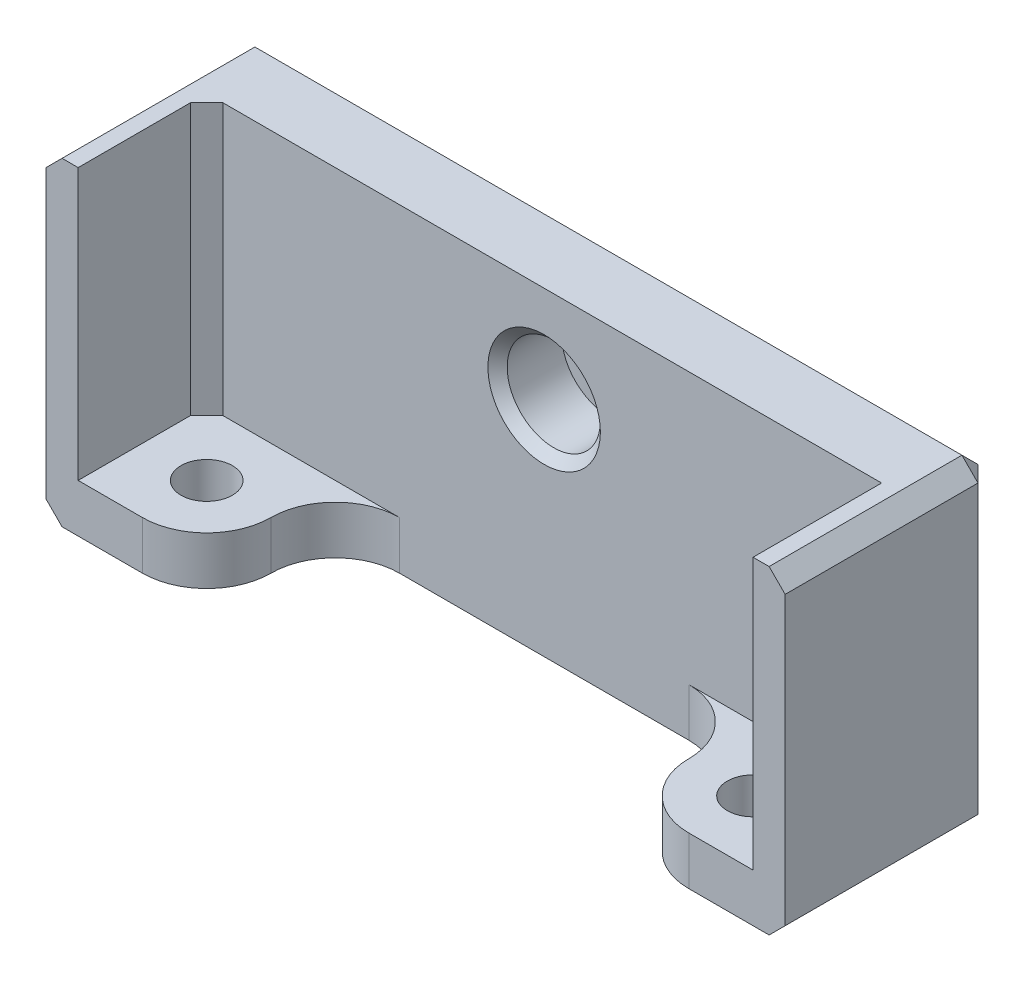
ISO-10303-21;
HEADER;
FILE_DESCRIPTION(('STEP AP214'),'2;1');
FILE_NAME('part.step','',(''),(''),'','','');
FILE_SCHEMA(('AUTOMOTIVE_DESIGN { 1 0 10303 214 1 1 1 1 }'));
ENDSEC;
DATA;
#1=APPLICATION_CONTEXT('core data for automotive mechanical design processes');
#2=APPLICATION_PROTOCOL_DEFINITION('international standard','automotive_design',2000,#1);
#3=PRODUCT_CONTEXT('',#1,'mechanical');
#4=PRODUCT('Part','Part','',(#3));
#5=PRODUCT_RELATED_PRODUCT_CATEGORY('part','',(#4));
#6=PRODUCT_DEFINITION_FORMATION('','',#4);
#7=PRODUCT_DEFINITION_CONTEXT('part definition',#1,'design');
#8=PRODUCT_DEFINITION('design','',#6,#7);
#9=PRODUCT_DEFINITION_SHAPE('','',#8);
#10=(LENGTH_UNIT() NAMED_UNIT(*) SI_UNIT(.MILLI.,.METRE.));
#11=(NAMED_UNIT(*) PLANE_ANGLE_UNIT() SI_UNIT($,.RADIAN.));
#12=(NAMED_UNIT(*) SI_UNIT($,.STERADIAN.) SOLID_ANGLE_UNIT());
#13=UNCERTAINTY_MEASURE_WITH_UNIT(LENGTH_MEASURE(1.E-05),#10,'distance_accuracy_value','');
#14=(GEOMETRIC_REPRESENTATION_CONTEXT(3) GLOBAL_UNCERTAINTY_ASSIGNED_CONTEXT((#13)) GLOBAL_UNIT_ASSIGNED_CONTEXT((#10,
#11,#12)) REPRESENTATION_CONTEXT('',''));
#15=CARTESIAN_POINT('',(0.,0.,0.));
#16=DIRECTION('',(0.,0.,1.));
#17=DIRECTION('',(1.,0.,0.));
#18=AXIS2_PLACEMENT_3D('',#15,#16,#17);
#19=CARTESIAN_POINT('',(0.,0.,4.));
#20=DIRECTION('',(0.,0.,1.));
#21=DIRECTION('',(1.,0.,0.));
#22=AXIS2_PLACEMENT_3D('',#19,#20,#21);
#23=PLANE('',#22);
#24=DIRECTION('',(-1.,0.,0.));
#25=VECTOR('',#24,1.);
#26=CARTESIAN_POINT('',(21.,6.,4.));
#27=LINE('',#26,#25);
#28=CARTESIAN_POINT('',(21.,6.,4.));
#29=VERTEX_POINT('',#28);
#30=CARTESIAN_POINT('',(-20.,6.,4.));
#31=VERTEX_POINT('',#30);
#32=EDGE_CURVE('E237',#29,#31,#27,.T.);
#33=ORIENTED_EDGE('',*,*,#32,.T.);
#34=DIRECTION('',(0.,-1.,0.));
#35=VECTOR('',#34,1.);
#36=CARTESIAN_POINT('',(-20.,-10.86,4.));
#37=LINE('',#36,#35);
#38=CARTESIAN_POINT('',(-20.,-10.86,4.));
#39=VERTEX_POINT('',#38);
#40=EDGE_CURVE('E289',#31,#39,#37,.T.);
#41=ORIENTED_EDGE('',*,*,#40,.T.);
#42=DIRECTION('',(-1.,0.,0.));
#43=VECTOR('',#42,1.);
#44=CARTESIAN_POINT('',(0.,-10.86,4.));
#45=LINE('',#44,#43);
#46=CARTESIAN_POINT('',(-9.,-10.86,4.));
#47=VERTEX_POINT('',#46);
#48=EDGE_CURVE('E192',#47,#39,#45,.T.);
#49=ORIENTED_EDGE('',*,*,#48,.F.);
#50=DIRECTION('',(0.,1.,0.));
#51=VECTOR('',#50,1.);
#52=CARTESIAN_POINT('',(-9.,-13.86,4.));
#53=LINE('',#52,#51);
#54=CARTESIAN_POINT('',(-9.,-13.86,4.));
#55=VERTEX_POINT('',#54);
#56=EDGE_CURVE('E249',#47,#55,#53,.F.);
#57=ORIENTED_EDGE('',*,*,#56,.T.);
#58=DIRECTION('',(1.,0.,0.));
#59=VECTOR('',#58,1.);
#60=CARTESIAN_POINT('',(7.93725393319378,-13.86,4.));
#61=LINE('',#60,#59);
#62=CARTESIAN_POINT('',(9.00000000000001,-13.86,4.));
#63=VERTEX_POINT('',#62);
#64=EDGE_CURVE('E230',#55,#63,#61,.T.);
#65=ORIENTED_EDGE('',*,*,#64,.T.);
#66=DIRECTION('',(0.,-1.,0.));
#67=VECTOR('',#66,1.);
#68=CARTESIAN_POINT('',(9.00000000000001,-10.86,4.));
#69=LINE('',#68,#67);
#70=CARTESIAN_POINT('',(9.00000000000001,-10.86,4.));
#71=VERTEX_POINT('',#70);
#72=EDGE_CURVE('E253',#63,#71,#69,.F.);
#73=ORIENTED_EDGE('',*,*,#72,.T.);
#74=DIRECTION('',(-1.,0.,0.));
#75=VECTOR('',#74,1.);
#76=CARTESIAN_POINT('',(0.,-10.86,4.));
#77=LINE('',#76,#75);
#78=CARTESIAN_POINT('',(21.,-10.86,4.));
#79=VERTEX_POINT('',#78);
#80=EDGE_CURVE('E422',#79,#71,#77,.T.);
#81=ORIENTED_EDGE('',*,*,#80,.F.);
#82=DIRECTION('',(0.,1.,0.));
#83=VECTOR('',#82,1.);
#84=CARTESIAN_POINT('',(21.,-13.86,4.));
#85=LINE('',#84,#83);
#86=EDGE_CURVE('E234',#79,#29,#85,.T.);
#87=ORIENTED_EDGE('',*,*,#86,.T.);
#88=EDGE_LOOP('',(#33,#41,#49,#57,#65,#73,#81,#87));
#89=FACE_BOUND('',#88,.T.);
#90=CARTESIAN_POINT('',(0.,0.,4.));
#91=DIRECTION('',(0.,0.,1.));
#92=DIRECTION('',(1.,0.,0.));
#93=AXIS2_PLACEMENT_3D('',#90,#91,#92);
#94=CIRCLE('',#93,3.5);
#95=CARTESIAN_POINT('',(3.5,0.,4.));
#96=VERTEX_POINT('',#95);
#97=EDGE_CURVE('E245',#96,#96,#94,.F.);
#98=ORIENTED_EDGE('',*,*,#97,.T.);
#99=EDGE_LOOP('',(#98));
#100=FACE_BOUND('',#99,.T.);
#101=ADVANCED_FACE('F41',(#89,#100),#23,.T.);
#102=CARTESIAN_POINT('',(21.,-13.86,4.));
#103=DIRECTION('',(0.,1.,0.));
#104=DIRECTION('',(-1.,0.,0.));
#105=AXIS2_PLACEMENT_3D('',#102,#103,#104);
#106=PLANE('',#105);
#107=DIRECTION('',(1.,0.,0.));
#108=VECTOR('',#107,1.);
#109=CARTESIAN_POINT('',(-23.,-13.86,12.));
#110=LINE('',#109,#108);
#111=CARTESIAN_POINT('',(-22.,-13.86,12.));
#112=VERTEX_POINT('',#111);
#113=CARTESIAN_POINT('',(-17.,-13.86,12.));
#114=VERTEX_POINT('',#113);
#115=EDGE_CURVE('E220',#112,#114,#110,.T.);
#116=ORIENTED_EDGE('',*,*,#115,.F.);
#117=DIRECTION('',(0.,0.,-1.));
#118=VECTOR('',#117,1.);
#119=CARTESIAN_POINT('',(-22.,-13.86,4.));
#120=LINE('',#119,#118);
#121=CARTESIAN_POINT('',(-22.,-13.86,0.));
#122=VERTEX_POINT('',#121);
#123=EDGE_CURVE('E327',#112,#122,#120,.T.);
#124=ORIENTED_EDGE('',*,*,#123,.T.);
#125=DIRECTION('',(1.,0.,0.));
#126=VECTOR('',#125,1.);
#127=CARTESIAN_POINT('',(23.,-13.86,0.));
#128=LINE('',#127,#126);
#129=CARTESIAN_POINT('',(22.,-13.86,0.));
#130=VERTEX_POINT('',#129);
#131=EDGE_CURVE('E321',#122,#130,#128,.T.);
#132=ORIENTED_EDGE('',*,*,#131,.T.);
#133=DIRECTION('',(0.,0.,1.));
#134=VECTOR('',#133,1.);
#135=CARTESIAN_POINT('',(22.,-13.86,4.));
#136=LINE('',#135,#134);
#137=CARTESIAN_POINT('',(22.,-13.86,12.));
#138=VERTEX_POINT('',#137);
#139=EDGE_CURVE('E324',#130,#138,#136,.T.);
#140=ORIENTED_EDGE('',*,*,#139,.T.);
#141=DIRECTION('',(-1.,0.,0.));
#142=VECTOR('',#141,1.);
#143=CARTESIAN_POINT('',(23.,-13.86,12.));
#144=LINE('',#143,#142);
#145=CARTESIAN_POINT('',(17.,-13.86,12.));
#146=VERTEX_POINT('',#145);
#147=EDGE_CURVE('E210',#138,#146,#144,.T.);
#148=ORIENTED_EDGE('',*,*,#147,.T.);
#149=CARTESIAN_POINT('',(17.,-13.86,8.));
#150=DIRECTION('',(0.,1.,0.));
#151=DIRECTION('',(-1.,0.,0.));
#152=AXIS2_PLACEMENT_3D('',#149,#150,#151);
#153=CIRCLE('',#152,4.);
#154=CARTESIAN_POINT('',(13.,-13.86,8.));
#155=VERTEX_POINT('',#154);
#156=EDGE_CURVE('E265',#146,#155,#153,.F.);
#157=ORIENTED_EDGE('',*,*,#156,.T.);
#158=CARTESIAN_POINT('',(9.00000000000001,-13.86,8.));
#159=DIRECTION('',(0.,1.,0.));
#160=DIRECTION('',(-1.,0.,0.));
#161=AXIS2_PLACEMENT_3D('',#158,#159,#160);
#162=CIRCLE('',#161,4.);
#163=EDGE_CURVE('E276',#155,#63,#162,.T.);
#164=ORIENTED_EDGE('',*,*,#163,.T.);
#165=ORIENTED_EDGE('',*,*,#64,.F.);
#166=CARTESIAN_POINT('',(-9.,-13.86,8.));
#167=DIRECTION('',(0.,1.,0.));
#168=DIRECTION('',(-1.,0.,0.));
#169=AXIS2_PLACEMENT_3D('',#166,#167,#168);
#170=CIRCLE('',#169,4.);
#171=CARTESIAN_POINT('',(-13.,-13.86,8.));
#172=VERTEX_POINT('',#171);
#173=EDGE_CURVE('E286',#55,#172,#170,.T.);
#174=ORIENTED_EDGE('',*,*,#173,.T.);
#175=CARTESIAN_POINT('',(-17.,-13.86,8.));
#176=DIRECTION('',(0.,1.,0.));
#177=DIRECTION('',(-1.,0.,0.));
#178=AXIS2_PLACEMENT_3D('',#175,#176,#177);
#179=CIRCLE('',#178,4.);
#180=EDGE_CURVE('E261',#172,#114,#179,.F.);
#181=ORIENTED_EDGE('',*,*,#180,.T.);
#182=EDGE_LOOP('',(#116,#124,#132,#140,#148,#157,#164,#165,#174,#181));
#183=FACE_BOUND('',#182,.T.);
#184=CARTESIAN_POINT('',(-17.,-13.86,8.));
#185=DIRECTION('',(0.,-1.,0.));
#186=DIRECTION('',(1.,0.,0.));
#187=AXIS2_PLACEMENT_3D('',#184,#185,#186);
#188=CIRCLE('',#187,1.6);
#189=CARTESIAN_POINT('',(-15.4,-13.86,8.));
#190=VERTEX_POINT('',#189);
#191=EDGE_CURVE('E425',#190,#190,#188,.T.);
#192=ORIENTED_EDGE('',*,*,#191,.F.);
#193=EDGE_LOOP('',(#192));
#194=FACE_BOUND('',#193,.T.);
#195=CARTESIAN_POINT('',(17.,-13.86,8.));
#196=DIRECTION('',(0.,-1.,0.));
#197=DIRECTION('',(-1.,0.,0.));
#198=AXIS2_PLACEMENT_3D('',#195,#196,#197);
#199=CIRCLE('',#198,1.6);
#200=CARTESIAN_POINT('',(15.4,-13.86,8.));
#201=VERTEX_POINT('',#200);
#202=EDGE_CURVE('E294',#201,#201,#199,.T.);
#203=ORIENTED_EDGE('',*,*,#202,.F.);
#204=EDGE_LOOP('',(#203));
#205=FACE_BOUND('',#204,.T.);
#206=ADVANCED_FACE('F490',(#183,#194,#205),#106,.F.);
#207=CARTESIAN_POINT('',(7.93725393319377,6.,4.));
#208=DIRECTION('',(0.,-1.,0.));
#209=DIRECTION('',(1.,0.,0.));
#210=AXIS2_PLACEMENT_3D('',#207,#208,#209);
#211=PLANE('',#210);
#212=DIRECTION('',(-1.,0.,0.));
#213=VECTOR('',#212,1.);
#214=CARTESIAN_POINT('',(-23.,6.,0.));
#215=LINE('',#214,#213);
#216=CARTESIAN_POINT('',(22.,6.,0.));
#217=VERTEX_POINT('',#216);
#218=CARTESIAN_POINT('',(-22.,6.,0.));
#219=VERTEX_POINT('',#218);
#220=EDGE_CURVE('E330',#217,#219,#215,.T.);
#221=ORIENTED_EDGE('',*,*,#220,.T.);
#222=DIRECTION('',(0.,0.,1.));
#223=VECTOR('',#222,1.);
#224=CARTESIAN_POINT('',(-22.,6.,4.));
#225=LINE('',#224,#223);
#226=CARTESIAN_POINT('',(-22.,6.,12.));
#227=VERTEX_POINT('',#226);
#228=EDGE_CURVE('E336',#219,#227,#225,.T.);
#229=ORIENTED_EDGE('',*,*,#228,.T.);
#230=DIRECTION('',(1.,0.,0.));
#231=VECTOR('',#230,1.);
#232=CARTESIAN_POINT('',(-23.,6.,12.));
#233=LINE('',#232,#231);
#234=CARTESIAN_POINT('',(-21.,6.,12.));
#235=VERTEX_POINT('',#234);
#236=EDGE_CURVE('E223',#227,#235,#233,.T.);
#237=ORIENTED_EDGE('',*,*,#236,.T.);
#238=DIRECTION('',(0.,0.,-1.));
#239=VECTOR('',#238,1.);
#240=CARTESIAN_POINT('',(-21.,6.,12.));
#241=LINE('',#240,#239);
#242=CARTESIAN_POINT('',(-21.,6.,4.99999999999999));
#243=VERTEX_POINT('',#242);
#244=EDGE_CURVE('E208',#235,#243,#241,.T.);
#245=ORIENTED_EDGE('',*,*,#244,.T.);
#246=DIRECTION('',(-0.70710678118655,0.,0.707106781186545));
#247=VECTOR('',#246,1.);
#248=CARTESIAN_POINT('',(-6.03137303340302,6.,-9.96862696659689));
#249=LINE('',#248,#247);
#250=EDGE_CURVE('E11',#243,#31,#249,.F.);
#251=ORIENTED_EDGE('',*,*,#250,.T.);
#252=ORIENTED_EDGE('',*,*,#32,.F.);
#253=DIRECTION('',(0.,0.,-1.));
#254=VECTOR('',#253,1.);
#255=CARTESIAN_POINT('',(21.,6.,12.));
#256=LINE('',#255,#254);
#257=CARTESIAN_POINT('',(21.,6.,12.));
#258=VERTEX_POINT('',#257);
#259=EDGE_CURVE('E439',#258,#29,#256,.T.);
#260=ORIENTED_EDGE('',*,*,#259,.F.);
#261=DIRECTION('',(-1.,0.,0.));
#262=VECTOR('',#261,1.);
#263=CARTESIAN_POINT('',(23.,6.,12.));
#264=LINE('',#263,#262);
#265=CARTESIAN_POINT('',(22.,6.,12.));
#266=VERTEX_POINT('',#265);
#267=EDGE_CURVE('E216',#266,#258,#264,.T.);
#268=ORIENTED_EDGE('',*,*,#267,.F.);
#269=DIRECTION('',(0.,0.,-1.));
#270=VECTOR('',#269,1.);
#271=CARTESIAN_POINT('',(22.,6.,4.));
#272=LINE('',#271,#270);
#273=EDGE_CURVE('E333',#266,#217,#272,.T.);
#274=ORIENTED_EDGE('',*,*,#273,.T.);
#275=EDGE_LOOP('',(#221,#229,#237,#245,#251,#252,#260,#268,#274));
#276=FACE_BOUND('',#275,.T.);
#277=ADVANCED_FACE('F460',(#276),#211,.F.);
#278=CARTESIAN_POINT('',(0.,0.,4.));
#279=DIRECTION('',(0.,0.,-1.));
#280=DIRECTION('',(-1.,0.,0.));
#281=AXIS2_PLACEMENT_3D('',#278,#279,#280);
#282=CYLINDRICAL_SURFACE('',#281,2.9);
#283=CARTESIAN_POINT('',(0.,0.,3.4));
#284=DIRECTION('',(0.,0.,1.));
#285=DIRECTION('',(1.,0.,0.));
#286=AXIS2_PLACEMENT_3D('',#283,#284,#285);
#287=CIRCLE('',#286,2.9);
#288=CARTESIAN_POINT('',(2.9,0.,3.4));
#289=VERTEX_POINT('',#288);
#290=EDGE_CURVE('E241',#289,#289,#287,.T.);
#291=ORIENTED_EDGE('',*,*,#290,.T.);
#292=EDGE_LOOP('',(#291));
#293=FACE_BOUND('',#292,.T.);
#294=CARTESIAN_POINT('',(0.,0.,0.));
#295=DIRECTION('',(0.,0.,1.));
#296=DIRECTION('',(1.,0.,0.));
#297=AXIS2_PLACEMENT_3D('',#294,#295,#296);
#298=CIRCLE('',#297,2.9);
#299=CARTESIAN_POINT('',(2.9,0.,0.));
#300=VERTEX_POINT('',#299);
#301=EDGE_CURVE('E226',#300,#300,#298,.T.);
#302=ORIENTED_EDGE('',*,*,#301,.F.);
#303=EDGE_LOOP('',(#302));
#304=FACE_BOUND('',#303,.T.);
#305=ADVANCED_FACE('F534',(#293,#304),#282,.F.);
#306=CARTESIAN_POINT('',(0.,0.,3.4));
#307=DIRECTION('',(0.,0.,1.));
#308=DIRECTION('',(1.,0.,0.));
#309=AXIS2_PLACEMENT_3D('',#306,#307,#308);
#310=CONICAL_SURFACE('',#309,2.9,0.785398163397449);
#311=ORIENTED_EDGE('',*,*,#97,.F.);
#312=EDGE_LOOP('',(#311));
#313=FACE_BOUND('',#312,.T.);
#314=ORIENTED_EDGE('',*,*,#290,.F.);
#315=EDGE_LOOP('',(#314));
#316=FACE_BOUND('',#315,.T.);
#317=ADVANCED_FACE('F539',(#313,#316),#310,.F.);
#318=CARTESIAN_POINT('',(-21.,0.,0.));
#319=DIRECTION('',(1.,0.,0.));
#320=DIRECTION('',(0.,1.,0.));
#321=AXIS2_PLACEMENT_3D('',#318,#319,#320);
#322=PLANE('',#321);
#323=DIRECTION('',(0.,0.,1.));
#324=VECTOR('',#323,1.);
#325=CARTESIAN_POINT('',(-21.,-10.86,0.));
#326=LINE('',#325,#324);
#327=CARTESIAN_POINT('',(-21.,-10.86,4.99999999999999));
#328=VERTEX_POINT('',#327);
#329=CARTESIAN_POINT('',(-21.,-10.86,12.));
#330=VERTEX_POINT('',#329);
#331=EDGE_CURVE('E181',#328,#330,#326,.T.);
#332=ORIENTED_EDGE('',*,*,#331,.F.);
#333=DIRECTION('',(0.,1.,0.));
#334=VECTOR('',#333,1.);
#335=CARTESIAN_POINT('',(-21.,6.,4.99999999999999));
#336=LINE('',#335,#334);
#337=EDGE_CURVE('E305',#328,#243,#336,.T.);
#338=ORIENTED_EDGE('',*,*,#337,.T.);
#339=ORIENTED_EDGE('',*,*,#244,.F.);
#340=DIRECTION('',(0.,1.,0.));
#341=VECTOR('',#340,1.);
#342=CARTESIAN_POINT('',(-21.,6.,12.));
#343=LINE('',#342,#341);
#344=EDGE_CURVE('E199',#330,#235,#343,.T.);
#345=ORIENTED_EDGE('',*,*,#344,.F.);
#346=EDGE_LOOP('',(#332,#338,#339,#345));
#347=FACE_BOUND('',#346,.T.);
#348=ADVANCED_FACE('F206',(#347),#322,.T.);
#349=CARTESIAN_POINT('',(-23.,6.,12.));
#350=DIRECTION('',(0.,0.,-1.));
#351=DIRECTION('',(0.,1.,0.));
#352=AXIS2_PLACEMENT_3D('',#349,#350,#351);
#353=PLANE('',#352);
#354=DIRECTION('',(0.,1.,0.));
#355=VECTOR('',#354,1.);
#356=CARTESIAN_POINT('',(-23.,6.,12.));
#357=LINE('',#356,#355);
#358=CARTESIAN_POINT('',(-23.,-12.86,12.));
#359=VERTEX_POINT('',#358);
#360=CARTESIAN_POINT('',(-23.,5.,12.));
#361=VERTEX_POINT('',#360);
#362=EDGE_CURVE('E214',#359,#361,#357,.T.);
#363=ORIENTED_EDGE('',*,*,#362,.F.);
#364=DIRECTION('',(-0.707106781186552,0.707106781186543,0.));
#365=VECTOR('',#364,1.);
#366=CARTESIAN_POINT('',(-23.,-12.86,12.));
#367=LINE('',#366,#365);
#368=EDGE_CURVE('E318',#359,#112,#367,.F.);
#369=ORIENTED_EDGE('',*,*,#368,.T.);
#370=ORIENTED_EDGE('',*,*,#115,.T.);
#371=DIRECTION('',(0.,-1.,0.));
#372=VECTOR('',#371,1.);
#373=CARTESIAN_POINT('',(-17.,-10.86,12.));
#374=LINE('',#373,#372);
#375=CARTESIAN_POINT('',(-17.,-10.86,12.));
#376=VERTEX_POINT('',#375);
#377=EDGE_CURVE('E202',#114,#376,#374,.F.);
#378=ORIENTED_EDGE('',*,*,#377,.T.);
#379=DIRECTION('',(-1.,0.,0.));
#380=VECTOR('',#379,1.);
#381=CARTESIAN_POINT('',(-23.,-10.86,12.));
#382=LINE('',#381,#380);
#383=EDGE_CURVE('E185',#376,#330,#382,.T.);
#384=ORIENTED_EDGE('',*,*,#383,.T.);
#385=ORIENTED_EDGE('',*,*,#344,.T.);
#386=ORIENTED_EDGE('',*,*,#236,.F.);
#387=DIRECTION('',(0.70710678118655,0.707106781186545,0.));
#388=VECTOR('',#387,1.);
#389=CARTESIAN_POINT('',(-23.,5.,12.));
#390=LINE('',#389,#388);
#391=EDGE_CURVE('E315',#227,#361,#390,.F.);
#392=ORIENTED_EDGE('',*,*,#391,.T.);
#393=EDGE_LOOP('',(#363,#369,#370,#378,#384,#385,#386,#392));
#394=FACE_BOUND('',#393,.T.);
#395=ADVANCED_FACE('F197',(#394),#353,.F.);
#396=CARTESIAN_POINT('',(-23.,0.,0.));
#397=DIRECTION('',(1.,0.,0.));
#398=DIRECTION('',(0.,1.,0.));
#399=AXIS2_PLACEMENT_3D('',#396,#397,#398);
#400=PLANE('',#399);
#401=DIRECTION('',(0.,1.,0.));
#402=VECTOR('',#401,1.);
#403=CARTESIAN_POINT('',(-23.,-13.86,-1.));
#404=LINE('',#403,#402);
#405=CARTESIAN_POINT('',(-23.,-12.86,-1.));
#406=VERTEX_POINT('',#405);
#407=CARTESIAN_POINT('',(-23.,5.,-1.));
#408=VERTEX_POINT('',#407);
#409=EDGE_CURVE('E299',#406,#408,#404,.T.);
#410=ORIENTED_EDGE('',*,*,#409,.F.);
#411=DIRECTION('',(0.,0.,1.));
#412=VECTOR('',#411,1.);
#413=CARTESIAN_POINT('',(-23.,-12.86,0.));
#414=LINE('',#413,#412);
#415=EDGE_CURVE('E311',#406,#359,#414,.T.);
#416=ORIENTED_EDGE('',*,*,#415,.T.);
#417=ORIENTED_EDGE('',*,*,#362,.T.);
#418=DIRECTION('',(0.,0.,-1.));
#419=VECTOR('',#418,1.);
#420=CARTESIAN_POINT('',(-23.,5.,0.));
#421=LINE('',#420,#419);
#422=EDGE_CURVE('E308',#361,#408,#421,.T.);
#423=ORIENTED_EDGE('',*,*,#422,.T.);
#424=EDGE_LOOP('',(#410,#416,#417,#423));
#425=FACE_BOUND('',#424,.T.);
#426=ADVANCED_FACE('F474',(#425),#400,.F.);
#427=CARTESIAN_POINT('',(21.,0.,0.));
#428=DIRECTION('',(-1.,0.,0.));
#429=DIRECTION('',(0.,1.,0.));
#430=AXIS2_PLACEMENT_3D('',#427,#428,#429);
#431=PLANE('',#430);
#432=DIRECTION('',(0.,0.,-1.));
#433=VECTOR('',#432,1.);
#434=CARTESIAN_POINT('',(21.,-10.86,0.));
#435=LINE('',#434,#433);
#436=CARTESIAN_POINT('',(21.,-10.86,12.));
#437=VERTEX_POINT('',#436);
#438=EDGE_CURVE('E418',#437,#79,#435,.T.);
#439=ORIENTED_EDGE('',*,*,#438,.F.);
#440=DIRECTION('',(0.,1.,0.));
#441=VECTOR('',#440,1.);
#442=CARTESIAN_POINT('',(21.,6.,12.));
#443=LINE('',#442,#441);
#444=EDGE_CURVE('E434',#437,#258,#443,.T.);
#445=ORIENTED_EDGE('',*,*,#444,.T.);
#446=ORIENTED_EDGE('',*,*,#259,.T.);
#447=ORIENTED_EDGE('',*,*,#86,.F.);
#448=EDGE_LOOP('',(#439,#445,#446,#447));
#449=FACE_BOUND('',#448,.T.);
#450=ADVANCED_FACE('F457',(#449),#431,.T.);
#451=CARTESIAN_POINT('',(23.,6.,12.));
#452=DIRECTION('',(0.,0.,1.));
#453=DIRECTION('',(0.,-1.,0.));
#454=AXIS2_PLACEMENT_3D('',#451,#452,#453);
#455=PLANE('',#454);
#456=DIRECTION('',(0.,1.,0.));
#457=VECTOR('',#456,1.);
#458=CARTESIAN_POINT('',(23.,6.,12.));
#459=LINE('',#458,#457);
#460=CARTESIAN_POINT('',(23.,-12.86,12.));
#461=VERTEX_POINT('',#460);
#462=CARTESIAN_POINT('',(23.,5.,12.));
#463=VERTEX_POINT('',#462);
#464=EDGE_CURVE('E435',#461,#463,#459,.T.);
#465=ORIENTED_EDGE('',*,*,#464,.T.);
#466=DIRECTION('',(0.707106781186551,-0.707106781186544,0.));
#467=VECTOR('',#466,1.);
#468=CARTESIAN_POINT('',(22.5,5.5,12.));
#469=LINE('',#468,#467);
#470=EDGE_CURVE('E351',#463,#266,#469,.F.);
#471=ORIENTED_EDGE('',*,*,#470,.T.);
#472=ORIENTED_EDGE('',*,*,#267,.T.);
#473=ORIENTED_EDGE('',*,*,#444,.F.);
#474=DIRECTION('',(-1.,0.,0.));
#475=VECTOR('',#474,1.);
#476=CARTESIAN_POINT('',(23.,-10.86,12.));
#477=LINE('',#476,#475);
#478=CARTESIAN_POINT('',(17.,-10.86,12.));
#479=VERTEX_POINT('',#478);
#480=EDGE_CURVE('E411',#437,#479,#477,.T.);
#481=ORIENTED_EDGE('',*,*,#480,.T.);
#482=DIRECTION('',(0.,-1.,0.));
#483=VECTOR('',#482,1.);
#484=CARTESIAN_POINT('',(17.,6.,12.));
#485=LINE('',#484,#483);
#486=EDGE_CURVE('E257',#479,#146,#485,.T.);
#487=ORIENTED_EDGE('',*,*,#486,.T.);
#488=ORIENTED_EDGE('',*,*,#147,.F.);
#489=DIRECTION('',(-0.707106781186545,-0.70710678118655,0.));
#490=VECTOR('',#489,1.);
#491=CARTESIAN_POINT('',(32.43,-3.42999999999993,12.));
#492=LINE('',#491,#490);
#493=EDGE_CURVE('E348',#138,#461,#492,.F.);
#494=ORIENTED_EDGE('',*,*,#493,.T.);
#495=EDGE_LOOP('',(#465,#471,#472,#473,#481,#487,#488,#494));
#496=FACE_BOUND('',#495,.T.);
#497=ADVANCED_FACE('F450',(#496),#455,.T.);
#498=CARTESIAN_POINT('',(23.,0.,0.));
#499=DIRECTION('',(-1.,0.,0.));
#500=DIRECTION('',(0.,1.,0.));
#501=AXIS2_PLACEMENT_3D('',#498,#499,#500);
#502=PLANE('',#501);
#503=DIRECTION('',(0.,1.,0.));
#504=VECTOR('',#503,1.);
#505=CARTESIAN_POINT('',(23.,6.,0.));
#506=LINE('',#505,#504);
#507=CARTESIAN_POINT('',(23.,-12.86,0.));
#508=VERTEX_POINT('',#507);
#509=CARTESIAN_POINT('',(23.,5.,0.));
#510=VERTEX_POINT('',#509);
#511=EDGE_CURVE('E339',#508,#510,#506,.T.);
#512=ORIENTED_EDGE('',*,*,#511,.T.);
#513=DIRECTION('',(0.,0.,1.));
#514=VECTOR('',#513,1.);
#515=CARTESIAN_POINT('',(23.,5.,0.));
#516=LINE('',#515,#514);
#517=EDGE_CURVE('E345',#510,#463,#516,.T.);
#518=ORIENTED_EDGE('',*,*,#517,.T.);
#519=ORIENTED_EDGE('',*,*,#464,.F.);
#520=DIRECTION('',(0.,0.,-1.));
#521=VECTOR('',#520,1.);
#522=CARTESIAN_POINT('',(23.,-12.86,0.));
#523=LINE('',#522,#521);
#524=EDGE_CURVE('E342',#461,#508,#523,.T.);
#525=ORIENTED_EDGE('',*,*,#524,.T.);
#526=EDGE_LOOP('',(#512,#518,#519,#525));
#527=FACE_BOUND('',#526,.T.);
#528=ADVANCED_FACE('F577',(#527),#502,.F.);
#529=CARTESIAN_POINT('',(0.,-10.86,0.));
#530=DIRECTION('',(0.,1.,0.));
#531=DIRECTION('',(-1.,0.,0.));
#532=AXIS2_PLACEMENT_3D('',#529,#530,#531);
#533=PLANE('',#532);
#534=CARTESIAN_POINT('',(-17.,-10.86,8.));
#535=DIRECTION('',(0.,-1.,0.));
#536=DIRECTION('',(1.,0.,0.));
#537=AXIS2_PLACEMENT_3D('',#534,#535,#536);
#538=CIRCLE('',#537,1.6);
#539=CARTESIAN_POINT('',(-15.4,-10.86,8.));
#540=VERTEX_POINT('',#539);
#541=EDGE_CURVE('E204',#540,#540,#538,.T.);
#542=ORIENTED_EDGE('',*,*,#541,.T.);
#543=EDGE_LOOP('',(#542));
#544=FACE_BOUND('',#543,.T.);
#545=ORIENTED_EDGE('',*,*,#48,.T.);
#546=DIRECTION('',(0.70710678118655,0.,-0.707106781186545));
#547=VECTOR('',#546,1.);
#548=CARTESIAN_POINT('',(-7.99999999999993,-10.86,-7.99999999999999));
#549=LINE('',#548,#547);
#550=EDGE_CURVE('E187',#39,#328,#549,.F.);
#551=ORIENTED_EDGE('',*,*,#550,.T.);
#552=ORIENTED_EDGE('',*,*,#331,.T.);
#553=ORIENTED_EDGE('',*,*,#383,.F.);
#554=CARTESIAN_POINT('',(-17.,-10.86,8.));
#555=DIRECTION('',(0.,1.,0.));
#556=DIRECTION('',(-1.,0.,0.));
#557=AXIS2_PLACEMENT_3D('',#554,#555,#556);
#558=CIRCLE('',#557,4.);
#559=CARTESIAN_POINT('',(-13.,-10.86,8.));
#560=VERTEX_POINT('',#559);
#561=EDGE_CURVE('E273',#376,#560,#558,.T.);
#562=ORIENTED_EDGE('',*,*,#561,.T.);
#563=CARTESIAN_POINT('',(-9.,-10.86,8.));
#564=DIRECTION('',(0.,1.,0.));
#565=DIRECTION('',(-1.,0.,0.));
#566=AXIS2_PLACEMENT_3D('',#563,#564,#565);
#567=CIRCLE('',#566,4.);
#568=EDGE_CURVE('E282',#560,#47,#567,.F.);
#569=ORIENTED_EDGE('',*,*,#568,.T.);
#570=EDGE_LOOP('',(#545,#551,#552,#553,#562,#569));
#571=FACE_BOUND('',#570,.T.);
#572=ADVANCED_FACE('F184',(#544,#571),#533,.T.);
#573=CARTESIAN_POINT('',(-17.,-10.86,8.));
#574=DIRECTION('',(0.,-1.,0.));
#575=DIRECTION('',(1.,0.,0.));
#576=AXIS2_PLACEMENT_3D('',#573,#574,#575);
#577=CYLINDRICAL_SURFACE('',#576,1.6);
#578=ORIENTED_EDGE('',*,*,#541,.F.);
#579=EDGE_LOOP('',(#578));
#580=FACE_BOUND('',#579,.T.);
#581=ORIENTED_EDGE('',*,*,#191,.T.);
#582=EDGE_LOOP('',(#581));
#583=FACE_BOUND('',#582,.T.);
#584=ADVANCED_FACE('F570',(#580,#583),#577,.F.);
#585=CARTESIAN_POINT('',(0.,-10.86,0.));
#586=DIRECTION('',(0.,1.,0.));
#587=DIRECTION('',(-1.,0.,0.));
#588=AXIS2_PLACEMENT_3D('',#585,#586,#587);
#589=PLANE('',#588);
#590=CARTESIAN_POINT('',(17.,-10.86,8.));
#591=DIRECTION('',(0.,-1.,0.));
#592=DIRECTION('',(-1.,0.,0.));
#593=AXIS2_PLACEMENT_3D('',#590,#591,#592);
#594=CIRCLE('',#593,1.6);
#595=CARTESIAN_POINT('',(15.4,-10.86,8.));
#596=VERTEX_POINT('',#595);
#597=EDGE_CURVE('E407',#596,#596,#594,.T.);
#598=ORIENTED_EDGE('',*,*,#597,.T.);
#599=EDGE_LOOP('',(#598));
#600=FACE_BOUND('',#599,.T.);
#601=ORIENTED_EDGE('',*,*,#80,.T.);
#602=CARTESIAN_POINT('',(9.00000000000001,-10.86,8.));
#603=DIRECTION('',(0.,1.,0.));
#604=DIRECTION('',(-1.,0.,0.));
#605=AXIS2_PLACEMENT_3D('',#602,#603,#604);
#606=CIRCLE('',#605,4.);
#607=CARTESIAN_POINT('',(13.,-10.86,8.));
#608=VERTEX_POINT('',#607);
#609=EDGE_CURVE('E279',#71,#608,#606,.F.);
#610=ORIENTED_EDGE('',*,*,#609,.T.);
#611=CARTESIAN_POINT('',(17.,-10.86,8.));
#612=DIRECTION('',(0.,1.,0.));
#613=DIRECTION('',(-1.,0.,0.));
#614=AXIS2_PLACEMENT_3D('',#611,#612,#613);
#615=CIRCLE('',#614,4.);
#616=EDGE_CURVE('E268',#608,#479,#615,.T.);
#617=ORIENTED_EDGE('',*,*,#616,.T.);
#618=ORIENTED_EDGE('',*,*,#480,.F.);
#619=ORIENTED_EDGE('',*,*,#438,.T.);
#620=EDGE_LOOP('',(#601,#610,#617,#618,#619));
#621=FACE_BOUND('',#620,.T.);
#622=ADVANCED_FACE('F509',(#600,#621),#589,.T.);
#623=CARTESIAN_POINT('',(17.,-10.86,8.));
#624=DIRECTION('',(0.,-1.,0.));
#625=DIRECTION('',(1.,0.,0.));
#626=AXIS2_PLACEMENT_3D('',#623,#624,#625);
#627=CYLINDRICAL_SURFACE('',#626,1.6);
#628=ORIENTED_EDGE('',*,*,#597,.F.);
#629=EDGE_LOOP('',(#628));
#630=FACE_BOUND('',#629,.T.);
#631=ORIENTED_EDGE('',*,*,#202,.T.);
#632=EDGE_LOOP('',(#631));
#633=FACE_BOUND('',#632,.T.);
#634=ADVANCED_FACE('F516',(#630,#633),#627,.F.);
#635=CARTESIAN_POINT('',(17.,6.,8.));
#636=DIRECTION('',(0.,-1.,0.));
#637=DIRECTION('',(0.,0.,-1.));
#638=AXIS2_PLACEMENT_3D('',#635,#636,#637);
#639=CYLINDRICAL_SURFACE('',#638,4.);
#640=ORIENTED_EDGE('',*,*,#486,.F.);
#641=ORIENTED_EDGE('',*,*,#616,.F.);
#642=DIRECTION('',(0.,-1.,0.));
#643=VECTOR('',#642,1.);
#644=CARTESIAN_POINT('',(13.,-10.86,8.));
#645=LINE('',#644,#643);
#646=EDGE_CURVE('E290',#155,#608,#645,.F.);
#647=ORIENTED_EDGE('',*,*,#646,.F.);
#648=ORIENTED_EDGE('',*,*,#156,.F.);
#649=EDGE_LOOP('',(#640,#641,#647,#648));
#650=FACE_BOUND('',#649,.T.);
#651=ADVANCED_FACE('F514',(#650),#639,.T.);
#652=CARTESIAN_POINT('',(9.00000000000001,-10.86,8.));
#653=DIRECTION('',(0.,1.,0.));
#654=DIRECTION('',(-1.,0.,0.));
#655=AXIS2_PLACEMENT_3D('',#652,#653,#654);
#656=CYLINDRICAL_SURFACE('',#655,4.);
#657=ORIENTED_EDGE('',*,*,#609,.F.);
#658=ORIENTED_EDGE('',*,*,#72,.F.);
#659=ORIENTED_EDGE('',*,*,#163,.F.);
#660=ORIENTED_EDGE('',*,*,#646,.T.);
#661=EDGE_LOOP('',(#657,#658,#659,#660));
#662=FACE_BOUND('',#661,.T.);
#663=ADVANCED_FACE('F507',(#662),#656,.F.);
#664=CARTESIAN_POINT('',(-17.,-10.86,8.));
#665=DIRECTION('',(0.,1.,0.));
#666=DIRECTION('',(0.,0.,1.));
#667=AXIS2_PLACEMENT_3D('',#664,#665,#666);
#668=CYLINDRICAL_SURFACE('',#667,4.);
#669=ORIENTED_EDGE('',*,*,#377,.F.);
#670=ORIENTED_EDGE('',*,*,#180,.F.);
#671=DIRECTION('',(0.,-1.,0.));
#672=VECTOR('',#671,1.);
#673=CARTESIAN_POINT('',(-13.,-13.86,8.));
#674=LINE('',#673,#672);
#675=EDGE_CURVE('E295',#560,#172,#674,.T.);
#676=ORIENTED_EDGE('',*,*,#675,.F.);
#677=ORIENTED_EDGE('',*,*,#561,.F.);
#678=EDGE_LOOP('',(#669,#670,#676,#677));
#679=FACE_BOUND('',#678,.T.);
#680=ADVANCED_FACE('F496',(#679),#668,.T.);
#681=CARTESIAN_POINT('',(-9.,-10.86,8.));
#682=DIRECTION('',(0.,-1.,0.));
#683=DIRECTION('',(1.,0.,0.));
#684=AXIS2_PLACEMENT_3D('',#681,#682,#683);
#685=CYLINDRICAL_SURFACE('',#684,4.);
#686=ORIENTED_EDGE('',*,*,#173,.F.);
#687=ORIENTED_EDGE('',*,*,#56,.F.);
#688=ORIENTED_EDGE('',*,*,#568,.F.);
#689=ORIENTED_EDGE('',*,*,#675,.T.);
#690=EDGE_LOOP('',(#686,#687,#688,#689));
#691=FACE_BOUND('',#690,.T.);
#692=ADVANCED_FACE('F500',(#691),#685,.F.);
#693=CARTESIAN_POINT('',(0.,0.,0.));
#694=DIRECTION('',(0.,0.,-1.));
#695=DIRECTION('',(-1.,0.,0.));
#696=AXIS2_PLACEMENT_3D('',#693,#694,#695);
#697=PLANE('',#696);
#698=CARTESIAN_POINT('',(0.,0.,0.));
#699=DIRECTION('',(0.,0.,-1.));
#700=DIRECTION('',(-1.,0.,0.));
#701=AXIS2_PLACEMENT_3D('',#698,#699,#700);
#702=CIRCLE('',#701,1.5);
#703=CARTESIAN_POINT('',(-1.5,0.,0.));
#704=VERTEX_POINT('',#703);
#705=EDGE_CURVE('E391',#704,#704,#702,.T.);
#706=ORIENTED_EDGE('',*,*,#705,.T.);
#707=EDGE_LOOP('',(#706));
#708=FACE_BOUND('',#707,.T.);
#709=ORIENTED_EDGE('',*,*,#301,.T.);
#710=EDGE_LOOP('',(#709));
#711=FACE_BOUND('',#710,.T.);
#712=ADVANCED_FACE('F557',(#708,#711),#697,.F.);
#713=CARTESIAN_POINT('',(0.,0.,-1.));
#714=DIRECTION('',(0.,0.,-1.));
#715=DIRECTION('',(-1.,0.,0.));
#716=AXIS2_PLACEMENT_3D('',#713,#714,#715);
#717=PLANE('',#716);
#718=DIRECTION('',(0.,-1.,0.));
#719=VECTOR('',#718,1.);
#720=CARTESIAN_POINT('',(22.,-13.86,-1.));
#721=LINE('',#720,#719);
#722=CARTESIAN_POINT('',(22.,5.,-1.));
#723=VERTEX_POINT('',#722);
#724=CARTESIAN_POINT('',(22.,-12.86,-1.));
#725=VERTEX_POINT('',#724);
#726=EDGE_CURVE('E60',#723,#725,#721,.T.);
#727=ORIENTED_EDGE('',*,*,#726,.T.);
#728=DIRECTION('',(-1.,0.,0.));
#729=VECTOR('',#728,1.);
#730=CARTESIAN_POINT('',(-23.,-12.86,-1.));
#731=LINE('',#730,#729);
#732=EDGE_CURVE('E52',#725,#406,#731,.T.);
#733=ORIENTED_EDGE('',*,*,#732,.T.);
#734=ORIENTED_EDGE('',*,*,#409,.T.);
#735=DIRECTION('',(1.,0.,0.));
#736=VECTOR('',#735,1.);
#737=CARTESIAN_POINT('',(23.,5.,-1.));
#738=LINE('',#737,#736);
#739=EDGE_CURVE('E65',#408,#723,#738,.T.);
#740=ORIENTED_EDGE('',*,*,#739,.T.);
#741=EDGE_LOOP('',(#727,#733,#734,#740));
#742=FACE_BOUND('',#741,.T.);
#743=CARTESIAN_POINT('',(0.,0.,-1.));
#744=DIRECTION('',(0.,0.,-1.));
#745=DIRECTION('',(-1.,0.,0.));
#746=AXIS2_PLACEMENT_3D('',#743,#744,#745);
#747=CIRCLE('',#746,1.5);
#748=CARTESIAN_POINT('',(-1.5,0.,-1.));
#749=VERTEX_POINT('',#748);
#750=EDGE_CURVE('E397',#749,#749,#747,.T.);
#751=ORIENTED_EDGE('',*,*,#750,.F.);
#752=EDGE_LOOP('',(#751));
#753=FACE_BOUND('',#752,.T.);
#754=ADVANCED_FACE('F476',(#742,#753),#717,.T.);
#755=CARTESIAN_POINT('',(0.,0.,-1.));
#756=DIRECTION('',(0.,0.,1.));
#757=DIRECTION('',(1.,0.,0.));
#758=AXIS2_PLACEMENT_3D('',#755,#756,#757);
#759=CYLINDRICAL_SURFACE('',#758,1.5);
#760=ORIENTED_EDGE('',*,*,#750,.T.);
#761=EDGE_LOOP('',(#760));
#762=FACE_BOUND('',#761,.T.);
#763=ORIENTED_EDGE('',*,*,#705,.F.);
#764=EDGE_LOOP('',(#763));
#765=FACE_BOUND('',#764,.T.);
#766=ADVANCED_FACE('F564',(#762,#765),#759,.F.);
#767=CARTESIAN_POINT('',(-20.,0.,4.));
#768=DIRECTION('',(0.707106781186545,0.,0.70710678118655));
#769=DIRECTION('',(0.,1.,0.));
#770=AXIS2_PLACEMENT_3D('',#767,#768,#769);
#771=PLANE('',#770);
#772=ORIENTED_EDGE('',*,*,#250,.F.);
#773=ORIENTED_EDGE('',*,*,#337,.F.);
#774=ORIENTED_EDGE('',*,*,#550,.F.);
#775=ORIENTED_EDGE('',*,*,#40,.F.);
#776=EDGE_LOOP('',(#772,#773,#774,#775));
#777=FACE_BOUND('',#776,.T.);
#778=ADVANCED_FACE('F466',(#777),#771,.T.);
#779=CARTESIAN_POINT('',(-23.,5.,0.));
#780=DIRECTION('',(0.707106781186545,-0.70710678118655,0.));
#781=DIRECTION('',(0.,0.,-1.));
#782=AXIS2_PLACEMENT_3D('',#779,#780,#781);
#783=PLANE('',#782);
#784=ORIENTED_EDGE('',*,*,#391,.F.);
#785=ORIENTED_EDGE('',*,*,#228,.F.);
#786=DIRECTION('',(-0.577350269189627,-0.577350269189623,-0.577350269189627));
#787=VECTOR('',#786,1.);
#788=CARTESIAN_POINT('',(-15.3333333333333,12.6666666666667,6.66666666666671));
#789=LINE('',#788,#787);
#790=EDGE_CURVE('E46',#408,#219,#789,.F.);
#791=ORIENTED_EDGE('',*,*,#790,.F.);
#792=ORIENTED_EDGE('',*,*,#422,.F.);
#793=EDGE_LOOP('',(#784,#785,#791,#792));
#794=FACE_BOUND('',#793,.T.);
#795=ADVANCED_FACE('F44',(#794),#783,.F.);
#796=CARTESIAN_POINT('',(22.,6.,4.));
#797=DIRECTION('',(-0.707106781186544,-0.707106781186551,0.));
#798=DIRECTION('',(0.,0.,-1.));
#799=AXIS2_PLACEMENT_3D('',#796,#797,#798);
#800=PLANE('',#799);
#801=ORIENTED_EDGE('',*,*,#470,.F.);
#802=ORIENTED_EDGE('',*,*,#517,.F.);
#803=DIRECTION('',(-0.707106781186551,0.707106781186544,0.));
#804=VECTOR('',#803,1.);
#805=CARTESIAN_POINT('',(22.,6.,0.));
#806=LINE('',#805,#804);
#807=EDGE_CURVE('E383',#217,#510,#806,.F.);
#808=ORIENTED_EDGE('',*,*,#807,.F.);
#809=ORIENTED_EDGE('',*,*,#273,.F.);
#810=EDGE_LOOP('',(#801,#802,#808,#809));
#811=FACE_BOUND('',#810,.T.);
#812=ADVANCED_FACE('F711',(#811),#800,.F.);
#813=CARTESIAN_POINT('',(0.,5.,-1.));
#814=DIRECTION('',(0.,0.70710678118655,-0.707106781186545));
#815=DIRECTION('',(-1.,0.,0.));
#816=AXIS2_PLACEMENT_3D('',#813,#814,#815);
#817=PLANE('',#816);
#818=ORIENTED_EDGE('',*,*,#790,.T.);
#819=ORIENTED_EDGE('',*,*,#220,.F.);
#820=DIRECTION('',(0.,0.707106781186545,0.70710678118655));
#821=VECTOR('',#820,1.);
#822=CARTESIAN_POINT('',(22.,6.,0.));
#823=LINE('',#822,#821);
#824=EDGE_CURVE('E380',#723,#217,#823,.T.);
#825=ORIENTED_EDGE('',*,*,#824,.F.);
#826=ORIENTED_EDGE('',*,*,#739,.F.);
#827=EDGE_LOOP('',(#818,#819,#825,#826));
#828=FACE_BOUND('',#827,.T.);
#829=ADVANCED_FACE('F718',(#828),#817,.T.);
#830=CARTESIAN_POINT('',(22.,6.,0.));
#831=DIRECTION('',(0.577350269189622,0.577350269189633,-0.577350269189623));
#832=DIRECTION('',(0.,0.707106781186541,0.707106781186554));
#833=AXIS2_PLACEMENT_3D('',#830,#831,#832);
#834=PLANE('',#833);
#835=ORIENTED_EDGE('',*,*,#824,.T.);
#836=ORIENTED_EDGE('',*,*,#807,.T.);
#837=DIRECTION('',(-0.707106781186548,0.,-0.707106781186547));
#838=VECTOR('',#837,1.);
#839=CARTESIAN_POINT('',(22.5,5.00000000000001,-0.5));
#840=LINE('',#839,#838);
#841=EDGE_CURVE('E376',#723,#510,#840,.F.);
#842=ORIENTED_EDGE('',*,*,#841,.F.);
#843=EDGE_LOOP('',(#835,#836,#842));
#844=FACE_BOUND('',#843,.T.);
#845=ADVANCED_FACE('F726',(#844),#834,.T.);
#846=CARTESIAN_POINT('',(22.,-13.86,4.));
#847=DIRECTION('',(-0.70710678118655,0.707106781186545,0.));
#848=DIRECTION('',(0.,0.,1.));
#849=AXIS2_PLACEMENT_3D('',#846,#847,#848);
#850=PLANE('',#849);
#851=ORIENTED_EDGE('',*,*,#493,.F.);
#852=ORIENTED_EDGE('',*,*,#139,.F.);
#853=DIRECTION('',(0.707106781186545,0.70710678118655,0.));
#854=VECTOR('',#853,1.);
#855=CARTESIAN_POINT('',(23.,-12.86,0.));
#856=LINE('',#855,#854);
#857=EDGE_CURVE('E372',#508,#130,#856,.F.);
#858=ORIENTED_EDGE('',*,*,#857,.F.);
#859=ORIENTED_EDGE('',*,*,#524,.F.);
#860=EDGE_LOOP('',(#851,#852,#858,#859));
#861=FACE_BOUND('',#860,.T.);
#862=ADVANCED_FACE('F734',(#861),#850,.F.);
#863=CARTESIAN_POINT('',(22.,0.,-1.));
#864=DIRECTION('',(0.707106781186547,0.,-0.707106781186548));
#865=DIRECTION('',(0.,1.,0.));
#866=AXIS2_PLACEMENT_3D('',#863,#864,#865);
#867=PLANE('',#866);
#868=ORIENTED_EDGE('',*,*,#841,.T.);
#869=ORIENTED_EDGE('',*,*,#511,.F.);
#870=DIRECTION('',(0.707106781186548,0.,0.707106781186547));
#871=VECTOR('',#870,1.);
#872=CARTESIAN_POINT('',(23.,-12.86,0.));
#873=LINE('',#872,#871);
#874=EDGE_CURVE('E368',#725,#508,#873,.T.);
#875=ORIENTED_EDGE('',*,*,#874,.F.);
#876=ORIENTED_EDGE('',*,*,#726,.F.);
#877=EDGE_LOOP('',(#868,#869,#875,#876));
#878=FACE_BOUND('',#877,.T.);
#879=ADVANCED_FACE('F742',(#878),#867,.T.);
#880=CARTESIAN_POINT('',(23.,-12.86,0.));
#881=DIRECTION('',(0.577350269189627,-0.577350269189628,-0.577350269189623));
#882=DIRECTION('',(0.707106781186548,0.707106781186547,0.));
#883=AXIS2_PLACEMENT_3D('',#880,#881,#882);
#884=PLANE('',#883);
#885=ORIENTED_EDGE('',*,*,#874,.T.);
#886=ORIENTED_EDGE('',*,*,#857,.T.);
#887=DIRECTION('',(0.,0.707106781186545,-0.70710678118655));
#888=VECTOR('',#887,1.);
#889=CARTESIAN_POINT('',(22.,-13.36,-0.5));
#890=LINE('',#889,#888);
#891=EDGE_CURVE('E364',#725,#130,#890,.F.);
#892=ORIENTED_EDGE('',*,*,#891,.F.);
#893=EDGE_LOOP('',(#885,#886,#892));
#894=FACE_BOUND('',#893,.T.);
#895=ADVANCED_FACE('F751',(#894),#884,.T.);
#896=CARTESIAN_POINT('',(0.,-12.86,-1.));
#897=DIRECTION('',(0.,-0.70710678118655,-0.707106781186545));
#898=DIRECTION('',(1.,0.,0.));
#899=AXIS2_PLACEMENT_3D('',#896,#897,#898);
#900=PLANE('',#899);
#901=ORIENTED_EDGE('',*,*,#891,.T.);
#902=ORIENTED_EDGE('',*,*,#131,.F.);
#903=DIRECTION('',(0.57735026918963,-0.577350269189622,0.577350269189626));
#904=VECTOR('',#903,1.);
#905=CARTESIAN_POINT('',(-15.3333333333332,-20.5266666666667,6.66666666666672));
#906=LINE('',#905,#904);
#907=EDGE_CURVE('E360',#406,#122,#906,.T.);
#908=ORIENTED_EDGE('',*,*,#907,.F.);
#909=ORIENTED_EDGE('',*,*,#732,.F.);
#910=EDGE_LOOP('',(#901,#902,#908,#909));
#911=FACE_BOUND('',#910,.T.);
#912=ADVANCED_FACE('F480',(#911),#900,.T.);
#913=CARTESIAN_POINT('',(-23.,-12.86,0.));
#914=DIRECTION('',(0.707106781186542,0.707106781186552,0.));
#915=DIRECTION('',(0.,0.,1.));
#916=AXIS2_PLACEMENT_3D('',#913,#914,#915);
#917=PLANE('',#916);
#918=ORIENTED_EDGE('',*,*,#907,.T.);
#919=ORIENTED_EDGE('',*,*,#123,.F.);
#920=ORIENTED_EDGE('',*,*,#368,.F.);
#921=ORIENTED_EDGE('',*,*,#415,.F.);
#922=EDGE_LOOP('',(#918,#919,#920,#921));
#923=FACE_BOUND('',#922,.T.);
#924=ADVANCED_FACE('F486',(#923),#917,.F.);
#925=CLOSED_SHELL('',(#101,#206,#277,#305,#317,#348,#395,#426,#450,#497,#528,#572,#584,#622,
#634,#651,#663,#680,#692,#712,#754,#766,#778,#795,#812,#829,#845,#862,#879,#895,#912,#924));
#926=MANIFOLD_SOLID_BREP('B2',#925);
#927=ADVANCED_BREP_SHAPE_REPRESENTATION('',(#18,#926),#14);
#928=SHAPE_DEFINITION_REPRESENTATION(#9,#927);
ENDSEC;
END-ISO-10303-21;
